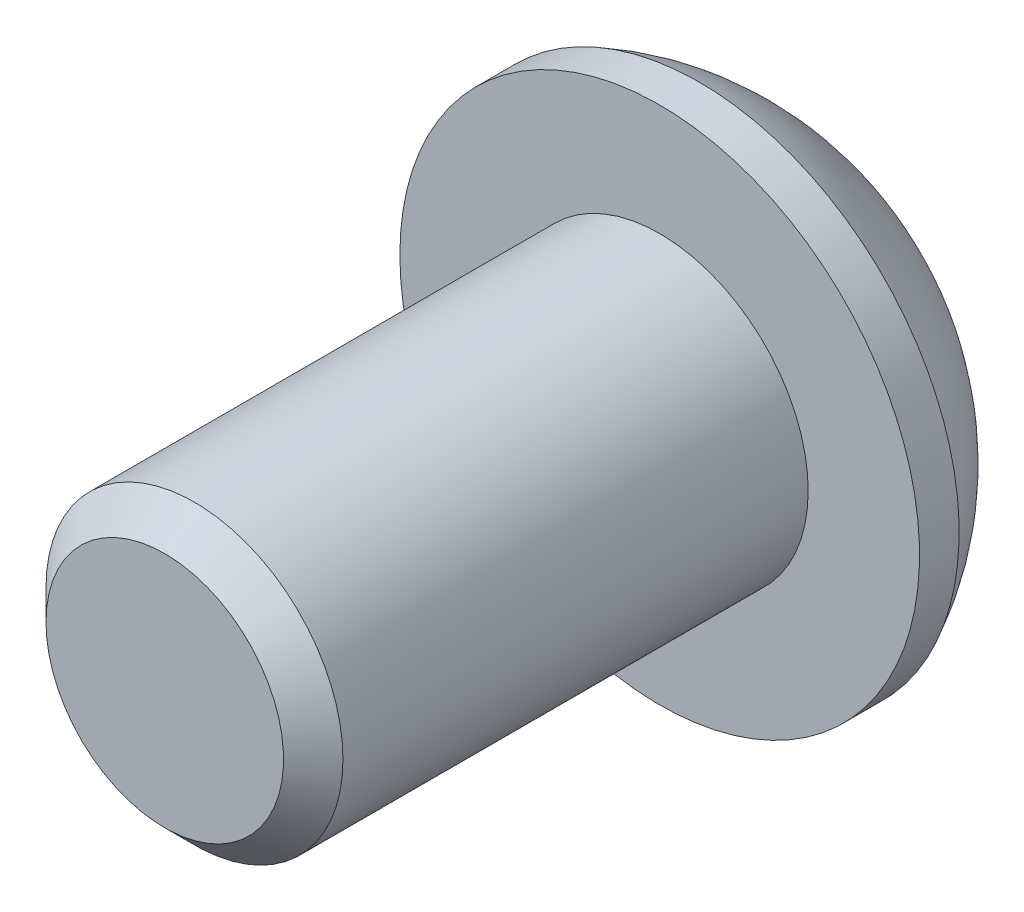
ISO-10303-21;
HEADER;
FILE_DESCRIPTION(('STEP AP214'),'2;1');
FILE_NAME('part.step','',(''),(''),'','','');
FILE_SCHEMA(('AUTOMOTIVE_DESIGN { 1 0 10303 214 1 1 1 1 }'));
ENDSEC;
DATA;
#1=APPLICATION_CONTEXT('core data for automotive mechanical design processes');
#2=APPLICATION_PROTOCOL_DEFINITION('international standard','automotive_design',2000,#1);
#3=PRODUCT_CONTEXT('',#1,'mechanical');
#4=PRODUCT('Part','Part','',(#3));
#5=PRODUCT_RELATED_PRODUCT_CATEGORY('part','',(#4));
#6=PRODUCT_DEFINITION_FORMATION('','',#4);
#7=PRODUCT_DEFINITION_CONTEXT('part definition',#1,'design');
#8=PRODUCT_DEFINITION('design','',#6,#7);
#9=PRODUCT_DEFINITION_SHAPE('','',#8);
#10=(LENGTH_UNIT() NAMED_UNIT(*) SI_UNIT(.MILLI.,.METRE.));
#11=(NAMED_UNIT(*) PLANE_ANGLE_UNIT() SI_UNIT($,.RADIAN.));
#12=(NAMED_UNIT(*) SI_UNIT($,.STERADIAN.) SOLID_ANGLE_UNIT());
#13=UNCERTAINTY_MEASURE_WITH_UNIT(LENGTH_MEASURE(1.E-05),#10,'distance_accuracy_value','');
#14=(GEOMETRIC_REPRESENTATION_CONTEXT(3) GLOBAL_UNCERTAINTY_ASSIGNED_CONTEXT((#13)) GLOBAL_UNIT_ASSIGNED_CONTEXT((#10,
#11,#12)) REPRESENTATION_CONTEXT('',''));
#15=CARTESIAN_POINT('',(0.,0.,0.));
#16=DIRECTION('',(0.,0.,1.));
#17=DIRECTION('',(1.,0.,0.));
#18=AXIS2_PLACEMENT_3D('',#15,#16,#17);
#19=CARTESIAN_POINT('',(0.,0.,-1.57));
#20=DIRECTION('',(0.,0.,1.));
#21=DIRECTION('',(1.,0.,0.));
#22=AXIS2_PLACEMENT_3D('',#19,#20,#21);
#23=PLANE('',#22);
#24=DIRECTION('',(-0.866025403784439,-0.5,0.));
#25=VECTOR('',#24,1.);
#26=CARTESIAN_POINT('',(-2.,1.15470053837925,-1.57));
#27=LINE('',#26,#25);
#28=CARTESIAN_POINT('',(-2.,1.15470053837925,-1.57));
#29=VERTEX_POINT('',#28);
#30=CARTESIAN_POINT('',(0.,2.3094010767585,-1.57));
#31=VERTEX_POINT('',#30);
#32=EDGE_CURVE('E130',#29,#31,#27,.F.);
#33=ORIENTED_EDGE('',*,*,#32,.T.);
#34=DIRECTION('',(-0.866025403784439,0.5,0.));
#35=VECTOR('',#34,1.);
#36=CARTESIAN_POINT('',(0.,2.3094010767585,-1.57));
#37=LINE('',#36,#35);
#38=CARTESIAN_POINT('',(2.,1.15470053837925,-1.57));
#39=VERTEX_POINT('',#38);
#40=EDGE_CURVE('E134',#31,#39,#37,.F.);
#41=ORIENTED_EDGE('',*,*,#40,.T.);
#42=DIRECTION('',(0.,1.,0.));
#43=VECTOR('',#42,1.);
#44=CARTESIAN_POINT('',(2.,1.15470053837925,-1.57));
#45=LINE('',#44,#43);
#46=CARTESIAN_POINT('',(2.,-1.15470053837925,-1.57));
#47=VERTEX_POINT('',#46);
#48=EDGE_CURVE('E68',#39,#47,#45,.F.);
#49=ORIENTED_EDGE('',*,*,#48,.T.);
#50=DIRECTION('',(0.866025403784439,0.499999999999999,0.));
#51=VECTOR('',#50,1.);
#52=CARTESIAN_POINT('',(2.,-1.15470053837925,-1.57));
#53=LINE('',#52,#51);
#54=CARTESIAN_POINT('',(0.,-2.3094010767585,-1.57));
#55=VERTEX_POINT('',#54);
#56=EDGE_CURVE('E70',#47,#55,#53,.F.);
#57=ORIENTED_EDGE('',*,*,#56,.T.);
#58=DIRECTION('',(0.866025403784438,-0.5,0.));
#59=VECTOR('',#58,1.);
#60=CARTESIAN_POINT('',(0.,-2.3094010767585,-1.57));
#61=LINE('',#60,#59);
#62=CARTESIAN_POINT('',(-2.,-1.15470053837925,-1.57));
#63=VERTEX_POINT('',#62);
#64=EDGE_CURVE('E72',#55,#63,#61,.F.);
#65=ORIENTED_EDGE('',*,*,#64,.T.);
#66=DIRECTION('',(0.,1.,0.));
#67=VECTOR('',#66,1.);
#68=CARTESIAN_POINT('',(-2.,-1.15470053837925,-1.57));
#69=LINE('',#68,#67);
#70=EDGE_CURVE('E125',#63,#29,#69,.T.);
#71=ORIENTED_EDGE('',*,*,#70,.T.);
#72=EDGE_LOOP('',(#33,#41,#49,#57,#65,#71));
#73=FACE_BOUND('',#72,.T.);
#74=ADVANCED_FACE('F17',(#73),#23,.F.);
#75=CARTESIAN_POINT('',(0.,-2.3094010767585,-3.3));
#76=DIRECTION('',(-0.5,-0.866025403784438,0.));
#77=DIRECTION('',(0.866025403784438,-0.5,0.));
#78=AXIS2_PLACEMENT_3D('',#75,#76,#77);
#79=PLANE('',#78);
#80=ORIENTED_EDGE('',*,*,#64,.F.);
#81=DIRECTION('',(0.,0.,1.));
#82=VECTOR('',#81,1.);
#83=CARTESIAN_POINT('',(0.,-2.3094010767585,-3.3));
#84=LINE('',#83,#82);
#85=CARTESIAN_POINT('',(0.,-2.3094010767585,-3.3));
#86=VERTEX_POINT('',#85);
#87=EDGE_CURVE('E77',#55,#86,#84,.F.);
#88=ORIENTED_EDGE('',*,*,#87,.T.);
#89=DIRECTION('',(0.866025403784439,-0.5,0.));
#90=VECTOR('',#89,1.);
#91=CARTESIAN_POINT('',(-2.,-1.15470053837925,-3.3));
#92=LINE('',#91,#90);
#93=CARTESIAN_POINT('',(-2.,-1.15470053837925,-3.3));
#94=VERTEX_POINT('',#93);
#95=EDGE_CURVE('E122',#94,#86,#92,.T.);
#96=ORIENTED_EDGE('',*,*,#95,.F.);
#97=DIRECTION('',(0.,0.,1.));
#98=VECTOR('',#97,1.);
#99=CARTESIAN_POINT('',(-2.,-1.15470053837925,-3.3));
#100=LINE('',#99,#98);
#101=EDGE_CURVE('E83',#94,#63,#100,.T.);
#102=ORIENTED_EDGE('',*,*,#101,.T.);
#103=EDGE_LOOP('',(#80,#88,#96,#102));
#104=FACE_BOUND('',#103,.T.);
#105=ADVANCED_FACE('F80',(#104),#79,.F.);
#106=CARTESIAN_POINT('',(2.,-1.15470053837925,-3.3));
#107=DIRECTION('',(0.499999999999999,-0.866025403784439,0.));
#108=DIRECTION('',(0.866025403784439,0.499999999999999,0.));
#109=AXIS2_PLACEMENT_3D('',#106,#107,#108);
#110=PLANE('',#109);
#111=ORIENTED_EDGE('',*,*,#56,.F.);
#112=DIRECTION('',(0.,0.,-1.));
#113=VECTOR('',#112,1.);
#114=CARTESIAN_POINT('',(2.,-1.15470053837925,-3.3));
#115=LINE('',#114,#113);
#116=CARTESIAN_POINT('',(2.,-1.15470053837925,-3.3));
#117=VERTEX_POINT('',#116);
#118=EDGE_CURVE('E91',#47,#117,#115,.T.);
#119=ORIENTED_EDGE('',*,*,#118,.T.);
#120=DIRECTION('',(0.866025403784439,0.499999999999999,0.));
#121=VECTOR('',#120,1.);
#122=CARTESIAN_POINT('',(0.,-2.3094010767585,-3.3));
#123=LINE('',#122,#121);
#124=EDGE_CURVE('E88',#86,#117,#123,.T.);
#125=ORIENTED_EDGE('',*,*,#124,.F.);
#126=ORIENTED_EDGE('',*,*,#87,.F.);
#127=EDGE_LOOP('',(#111,#119,#125,#126));
#128=FACE_BOUND('',#127,.T.);
#129=ADVANCED_FACE('F86',(#128),#110,.F.);
#130=CARTESIAN_POINT('',(2.,1.15470053837925,-3.3));
#131=DIRECTION('',(1.,0.,0.));
#132=DIRECTION('',(0.,0.,-1.));
#133=AXIS2_PLACEMENT_3D('',#130,#131,#132);
#134=PLANE('',#133);
#135=ORIENTED_EDGE('',*,*,#48,.F.);
#136=DIRECTION('',(0.,0.,1.));
#137=VECTOR('',#136,1.);
#138=CARTESIAN_POINT('',(2.,1.15470053837925,-3.3));
#139=LINE('',#138,#137);
#140=CARTESIAN_POINT('',(2.,1.15470053837925,-3.3));
#141=VERTEX_POINT('',#140);
#142=EDGE_CURVE('E132',#39,#141,#139,.F.);
#143=ORIENTED_EDGE('',*,*,#142,.T.);
#144=DIRECTION('',(0.,1.,0.));
#145=VECTOR('',#144,1.);
#146=CARTESIAN_POINT('',(2.,-1.3125,-3.3));
#147=LINE('',#146,#145);
#148=EDGE_CURVE('E118',#117,#141,#147,.T.);
#149=ORIENTED_EDGE('',*,*,#148,.F.);
#150=ORIENTED_EDGE('',*,*,#118,.F.);
#151=EDGE_LOOP('',(#135,#143,#149,#150));
#152=FACE_BOUND('',#151,.T.);
#153=ADVANCED_FACE('F137',(#152),#134,.F.);
#154=CARTESIAN_POINT('',(0.,2.3094010767585,-3.3));
#155=DIRECTION('',(0.5,0.866025403784439,0.));
#156=DIRECTION('',(-0.866025403784439,0.5,0.));
#157=AXIS2_PLACEMENT_3D('',#154,#155,#156);
#158=PLANE('',#157);
#159=ORIENTED_EDGE('',*,*,#40,.F.);
#160=DIRECTION('',(0.,0.,1.));
#161=VECTOR('',#160,1.);
#162=CARTESIAN_POINT('',(0.,2.3094010767585,-3.3));
#163=LINE('',#162,#161);
#164=CARTESIAN_POINT('',(0.,2.3094010767585,-3.3));
#165=VERTEX_POINT('',#164);
#166=EDGE_CURVE('E128',#31,#165,#163,.F.);
#167=ORIENTED_EDGE('',*,*,#166,.T.);
#168=DIRECTION('',(-0.866025403784439,0.5,0.));
#169=VECTOR('',#168,1.);
#170=CARTESIAN_POINT('',(2.,1.15470053837925,-3.3));
#171=LINE('',#170,#169);
#172=EDGE_CURVE('E115',#141,#165,#171,.T.);
#173=ORIENTED_EDGE('',*,*,#172,.F.);
#174=ORIENTED_EDGE('',*,*,#142,.F.);
#175=EDGE_LOOP('',(#159,#167,#173,#174));
#176=FACE_BOUND('',#175,.T.);
#177=ADVANCED_FACE('F149',(#176),#158,.F.);
#178=CARTESIAN_POINT('',(-2.,1.15470053837925,-3.3));
#179=DIRECTION('',(-0.5,0.866025403784439,0.));
#180=DIRECTION('',(-0.866025403784439,-0.5,0.));
#181=AXIS2_PLACEMENT_3D('',#178,#179,#180);
#182=PLANE('',#181);
#183=ORIENTED_EDGE('',*,*,#32,.F.);
#184=DIRECTION('',(0.,0.,1.));
#185=VECTOR('',#184,1.);
#186=CARTESIAN_POINT('',(-2.,1.15470053837925,-3.3));
#187=LINE('',#186,#185);
#188=CARTESIAN_POINT('',(-2.,1.15470053837925,-3.3));
#189=VERTEX_POINT('',#188);
#190=EDGE_CURVE('E35',#29,#189,#187,.F.);
#191=ORIENTED_EDGE('',*,*,#190,.T.);
#192=DIRECTION('',(-0.866025403784439,-0.499999999999999,0.));
#193=VECTOR('',#192,1.);
#194=CARTESIAN_POINT('',(0.,2.3094010767585,-3.3));
#195=LINE('',#194,#193);
#196=EDGE_CURVE('E112',#165,#189,#195,.T.);
#197=ORIENTED_EDGE('',*,*,#196,.F.);
#198=ORIENTED_EDGE('',*,*,#166,.F.);
#199=EDGE_LOOP('',(#183,#191,#197,#198));
#200=FACE_BOUND('',#199,.T.);
#201=ADVANCED_FACE('F147',(#200),#182,.F.);
#202=CARTESIAN_POINT('',(-2.,-1.15470053837925,-3.3));
#203=DIRECTION('',(-1.,0.,0.));
#204=DIRECTION('',(0.,0.,1.));
#205=AXIS2_PLACEMENT_3D('',#202,#203,#204);
#206=PLANE('',#205);
#207=ORIENTED_EDGE('',*,*,#70,.F.);
#208=ORIENTED_EDGE('',*,*,#101,.F.);
#209=DIRECTION('',(0.,1.,0.));
#210=VECTOR('',#209,1.);
#211=CARTESIAN_POINT('',(-2.,-1.3125,-3.3));
#212=LINE('',#211,#210);
#213=EDGE_CURVE('E107',#189,#94,#212,.F.);
#214=ORIENTED_EDGE('',*,*,#213,.F.);
#215=ORIENTED_EDGE('',*,*,#190,.F.);
#216=EDGE_LOOP('',(#207,#208,#214,#215));
#217=FACE_BOUND('',#216,.T.);
#218=ADVANCED_FACE('F144',(#217),#206,.F.);
#219=CARTESIAN_POINT('',(0.,-1.3125,-3.3));
#220=DIRECTION('',(0.,0.,-1.));
#221=DIRECTION('',(-1.,0.,0.));
#222=AXIS2_PLACEMENT_3D('',#219,#220,#221);
#223=PLANE('',#222);
#224=ORIENTED_EDGE('',*,*,#196,.T.);
#225=ORIENTED_EDGE('',*,*,#213,.T.);
#226=ORIENTED_EDGE('',*,*,#95,.T.);
#227=ORIENTED_EDGE('',*,*,#124,.T.);
#228=ORIENTED_EDGE('',*,*,#148,.T.);
#229=ORIENTED_EDGE('',*,*,#172,.T.);
#230=EDGE_LOOP('',(#224,#225,#226,#227,#228,#229));
#231=FACE_BOUND('',#230,.T.);
#232=CARTESIAN_POINT('',(0.,0.,-3.3));
#233=DIRECTION('',(0.,0.,-1.));
#234=DIRECTION('',(-1.,0.,0.));
#235=AXIS2_PLACEMENT_3D('',#232,#233,#234);
#236=CIRCLE('',#235,2.625);
#237=CARTESIAN_POINT('',(-2.625,0.,-3.3));
#238=VERTEX_POINT('',#237);
#239=EDGE_CURVE('E20',#238,#238,#236,.F.);
#240=ORIENTED_EDGE('',*,*,#239,.F.);
#241=EDGE_LOOP('',(#240));
#242=FACE_BOUND('',#241,.T.);
#243=ADVANCED_FACE('F141',(#231,#242),#223,.T.);
#244=CARTESIAN_POINT('',(0.,0.,1.618125));
#245=DIRECTION('',(0.,0.,-1.));
#246=DIRECTION('',(0.,-1.,0.));
#247=AXIS2_PLACEMENT_3D('',#244,#245,#246);
#248=DEGENERATE_TOROIDAL_SURFACE('',#247,0.444047619047619,5.38000992597661,.T.);
#249=CARTESIAN_POINT('',(0.,0.,-0.800000000000002));
#250=DIRECTION('',(0.,0.,-1.));
#251=DIRECTION('',(-1.,0.,0.));
#252=AXIS2_PLACEMENT_3D('',#249,#250,#251);
#253=CIRCLE('',#252,5.25);
#254=CARTESIAN_POINT('',(-5.25,0.,-0.800000000000002));
#255=VERTEX_POINT('',#254);
#256=EDGE_CURVE('E99',#255,#255,#253,.F.);
#257=ORIENTED_EDGE('',*,*,#256,.F.);
#258=EDGE_LOOP('',(#257));
#259=FACE_BOUND('',#258,.T.);
#260=ORIENTED_EDGE('',*,*,#239,.T.);
#261=EDGE_LOOP('',(#260));
#262=FACE_BOUND('',#261,.T.);
#263=ADVANCED_FACE('F182',(#259,#262),#248,.T.);
#264=CARTESIAN_POINT('',(0.,0.,10.));
#265=DIRECTION('',(0.,0.,1.));
#266=DIRECTION('',(1.,0.,0.));
#267=AXIS2_PLACEMENT_3D('',#264,#265,#266);
#268=PLANE('',#267);
#269=CARTESIAN_POINT('',(0.,0.,9.99999999999091));
#270=DIRECTION('',(0.,0.,-1.));
#271=DIRECTION('',(-1.,0.,0.));
#272=AXIS2_PLACEMENT_3D('',#269,#270,#271);
#273=CIRCLE('',#272,2.39999999996598);
#274=CARTESIAN_POINT('',(-2.39999999996598,0.,9.99999999999091));
#275=VERTEX_POINT('',#274);
#276=EDGE_CURVE('E97',#275,#275,#273,.T.);
#277=ORIENTED_EDGE('',*,*,#276,.F.);
#278=EDGE_LOOP('',(#277));
#279=FACE_BOUND('',#278,.T.);
#280=ADVANCED_FACE('F178',(#279),#268,.T.);
#281=CARTESIAN_POINT('',(0.,0.,-0.4));
#282=DIRECTION('',(0.,0.,-1.));
#283=DIRECTION('',(-1.,0.,0.));
#284=AXIS2_PLACEMENT_3D('',#281,#282,#283);
#285=CYLINDRICAL_SURFACE('',#284,5.25);
#286=CARTESIAN_POINT('',(0.,0.,0.));
#287=DIRECTION('',(0.,0.,-1.));
#288=DIRECTION('',(-1.,0.,0.));
#289=AXIS2_PLACEMENT_3D('',#286,#287,#288);
#290=CIRCLE('',#289,5.25);
#291=CARTESIAN_POINT('',(-5.25,0.,0.));
#292=VERTEX_POINT('',#291);
#293=EDGE_CURVE('E95',#292,#292,#290,.T.);
#294=ORIENTED_EDGE('',*,*,#293,.T.);
#295=EDGE_LOOP('',(#294));
#296=FACE_BOUND('',#295,.T.);
#297=ORIENTED_EDGE('',*,*,#256,.T.);
#298=EDGE_LOOP('',(#297));
#299=FACE_BOUND('',#298,.T.);
#300=ADVANCED_FACE('F174',(#296,#299),#285,.T.);
#301=CARTESIAN_POINT('',(0.,0.,9.40000000002783));
#302=DIRECTION('',(0.,0.,-1.));
#303=DIRECTION('',(-1.,0.,0.));
#304=AXIS2_PLACEMENT_3D('',#301,#302,#303);
#305=CONICAL_SURFACE('',#304,2.99999999992906,0.785398163397448);
#306=CARTESIAN_POINT('',(0.,0.,9.4));
#307=DIRECTION('',(0.,0.,1.));
#308=DIRECTION('',(1.,0.,0.));
#309=AXIS2_PLACEMENT_3D('',#306,#307,#308);
#310=CIRCLE('',#309,3.);
#311=CARTESIAN_POINT('',(3.,0.,9.4));
#312=VERTEX_POINT('',#311);
#313=EDGE_CURVE('E26',#312,#312,#310,.F.);
#314=ORIENTED_EDGE('',*,*,#313,.F.);
#315=EDGE_LOOP('',(#314));
#316=FACE_BOUND('',#315,.T.);
#317=ORIENTED_EDGE('',*,*,#276,.T.);
#318=EDGE_LOOP('',(#317));
#319=FACE_BOUND('',#318,.T.);
#320=ADVANCED_FACE('F167',(#316,#319),#305,.T.);
#321=CARTESIAN_POINT('',(0.,-2.625,0.));
#322=DIRECTION('',(0.,0.,-1.));
#323=DIRECTION('',(-1.,0.,0.));
#324=AXIS2_PLACEMENT_3D('',#321,#322,#323);
#325=PLANE('',#324);
#326=CARTESIAN_POINT('',(0.,0.,0.));
#327=DIRECTION('',(0.,0.,1.));
#328=DIRECTION('',(1.,0.,0.));
#329=AXIS2_PLACEMENT_3D('',#326,#327,#328);
#330=CIRCLE('',#329,3.);
#331=CARTESIAN_POINT('',(3.,0.,0.));
#332=VERTEX_POINT('',#331);
#333=EDGE_CURVE('E11',#332,#332,#330,.T.);
#334=ORIENTED_EDGE('',*,*,#333,.F.);
#335=EDGE_LOOP('',(#334));
#336=FACE_BOUND('',#335,.T.);
#337=ORIENTED_EDGE('',*,*,#293,.F.);
#338=EDGE_LOOP('',(#337));
#339=FACE_BOUND('',#338,.T.);
#340=ADVANCED_FACE('F161',(#336,#339),#325,.F.);
#341=CARTESIAN_POINT('',(0.,0.,0.));
#342=DIRECTION('',(0.,0.,1.));
#343=DIRECTION('',(1.,0.,0.));
#344=AXIS2_PLACEMENT_3D('',#341,#342,#343);
#345=CYLINDRICAL_SURFACE('',#344,3.);
#346=ORIENTED_EDGE('',*,*,#333,.T.);
#347=EDGE_LOOP('',(#346));
#348=FACE_BOUND('',#347,.T.);
#349=ORIENTED_EDGE('',*,*,#313,.T.);
#350=EDGE_LOOP('',(#349));
#351=FACE_BOUND('',#350,.T.);
#352=ADVANCED_FACE('F159',(#348,#351),#345,.T.);
#353=CLOSED_SHELL('',(#74,#105,#129,#153,#177,#201,#218,#243,#263,#280,#300,#320,#340,#352));
#354=MANIFOLD_SOLID_BREP('B1',#353);
#355=ADVANCED_BREP_SHAPE_REPRESENTATION('',(#18,#354),#14);
#356=SHAPE_DEFINITION_REPRESENTATION(#9,#355);
ENDSEC;
END-ISO-10303-21;
